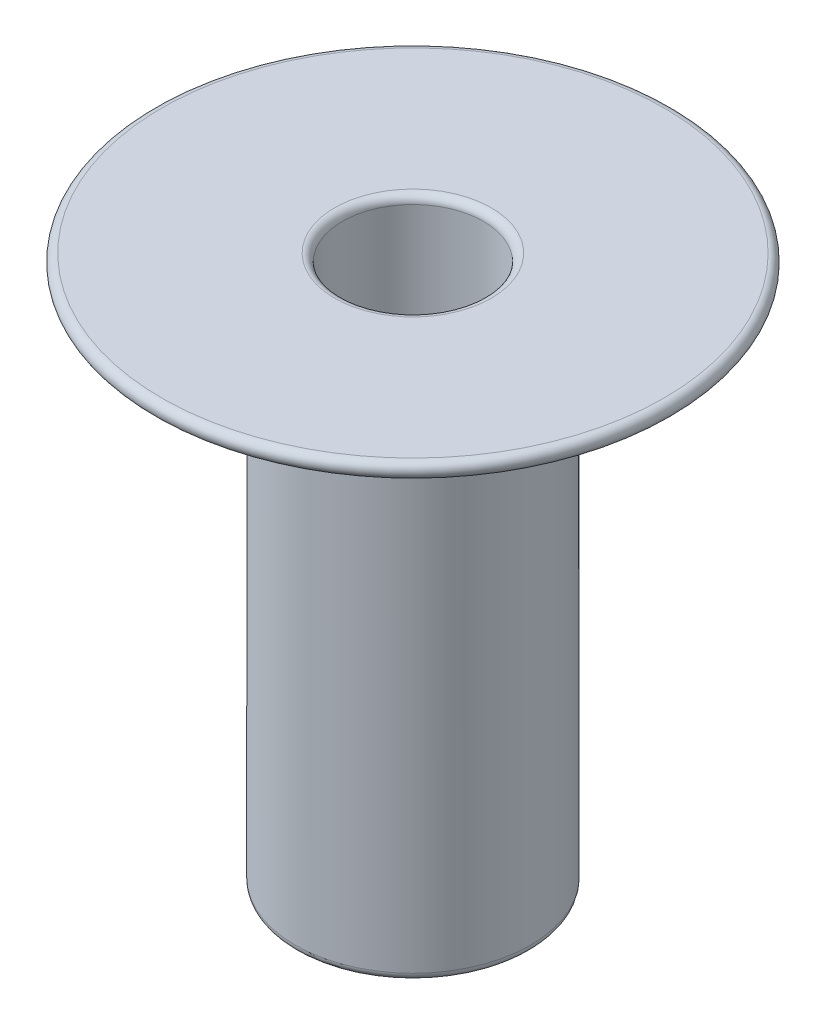
ISO-10303-21;
HEADER;
FILE_DESCRIPTION(('STEP AP214'),'2;1');
FILE_NAME('part.step','',(''),(''),'','','');
FILE_SCHEMA(('AUTOMOTIVE_DESIGN { 1 0 10303 214 1 1 1 1 }'));
ENDSEC;
DATA;
#1=APPLICATION_CONTEXT('core data for automotive mechanical design processes');
#2=APPLICATION_PROTOCOL_DEFINITION('international standard','automotive_design',2000,#1);
#3=PRODUCT_CONTEXT('',#1,'mechanical');
#4=PRODUCT('Part','Part','',(#3));
#5=PRODUCT_RELATED_PRODUCT_CATEGORY('part','',(#4));
#6=PRODUCT_DEFINITION_FORMATION('','',#4);
#7=PRODUCT_DEFINITION_CONTEXT('part definition',#1,'design');
#8=PRODUCT_DEFINITION('design','',#6,#7);
#9=PRODUCT_DEFINITION_SHAPE('','',#8);
#10=(LENGTH_UNIT() NAMED_UNIT(*) SI_UNIT(.MILLI.,.METRE.));
#11=(NAMED_UNIT(*) PLANE_ANGLE_UNIT() SI_UNIT($,.RADIAN.));
#12=(NAMED_UNIT(*) SI_UNIT($,.STERADIAN.) SOLID_ANGLE_UNIT());
#13=UNCERTAINTY_MEASURE_WITH_UNIT(LENGTH_MEASURE(1.E-05),#10,'distance_accuracy_value','');
#14=(GEOMETRIC_REPRESENTATION_CONTEXT(3) GLOBAL_UNCERTAINTY_ASSIGNED_CONTEXT((#13)) GLOBAL_UNIT_ASSIGNED_CONTEXT((#10,
#11,#12)) REPRESENTATION_CONTEXT('',''));
#15=CARTESIAN_POINT('',(0.,0.,0.));
#16=DIRECTION('',(0.,0.,1.));
#17=DIRECTION('',(1.,0.,0.));
#18=AXIS2_PLACEMENT_3D('',#15,#16,#17);
#19=CARTESIAN_POINT('',(0.,-4.6,0.));
#20=DIRECTION('',(-7.45706304105601E-13,-1.,0.));
#21=DIRECTION('',(1.,-7.45706304105601E-13,0.));
#22=AXIS2_PLACEMENT_3D('',#19,#20,#21);
#23=CYLINDRICAL_SURFACE('',#22,0.900000000004325);
#24=CARTESIAN_POINT('',(3.50481962929609E-12,0.0999999999996854,0.));
#25=DIRECTION('',(-7.45706304105601E-13,-1.,0.));
#26=DIRECTION('',(1.,-7.45706304105601E-13,0.));
#27=AXIS2_PLACEMENT_3D('',#24,#25,#26);
#28=CIRCLE('',#27,0.900000000004325);
#29=CARTESIAN_POINT('',(0.90000000000783,0.0999999999990143,0.));
#30=VERTEX_POINT('',#29);
#31=EDGE_CURVE('E54',#30,#30,#28,.T.);
#32=ORIENTED_EDGE('',*,*,#31,.T.);
#33=EDGE_LOOP('',(#32));
#34=FACE_BOUND('',#33,.T.);
#35=CARTESIAN_POINT('',(5.14537349832739E-12,2.29999999999831,0.));
#36=DIRECTION('',(-7.45706304105601E-13,-1.,0.));
#37=DIRECTION('',(1.,-7.45706304105601E-13,0.));
#38=AXIS2_PLACEMENT_3D('',#35,#36,#37);
#39=CIRCLE('',#38,0.900000000004325);
#40=CARTESIAN_POINT('',(0.90000000000947,2.29999999999764,0.));
#41=VERTEX_POINT('',#40);
#42=EDGE_CURVE('E57',#41,#41,#39,.F.);
#43=ORIENTED_EDGE('',*,*,#42,.T.);
#44=EDGE_LOOP('',(#43));
#45=FACE_BOUND('',#44,.T.);
#46=ADVANCED_FACE('F34',(#34,#45),#23,.F.);
#47=CARTESIAN_POINT('',(-0.9,2.39999999999898,0.));
#48=DIRECTION('',(-7.45706304105601E-13,-1.,0.));
#49=DIRECTION('',(1.,-7.45706304105601E-13,0.));
#50=AXIS2_PLACEMENT_3D('',#47,#48,#49);
#51=PLANE('',#50);
#52=CARTESIAN_POINT('',(5.21994412873795E-12,2.39999999999831,0.));
#53=DIRECTION('',(-7.45706304105601E-13,-1.,0.));
#54=DIRECTION('',(1.,-7.45706304105601E-13,0.));
#55=AXIS2_PLACEMENT_3D('',#52,#53,#54);
#56=CIRCLE('',#55,1.00000000000433);
#57=CARTESIAN_POINT('',(1.00000000000955,2.39999999999756,0.));
#58=VERTEX_POINT('',#57);
#59=EDGE_CURVE('E41',#58,#58,#56,.T.);
#60=ORIENTED_EDGE('',*,*,#59,.T.);
#61=EDGE_LOOP('',(#60));
#62=FACE_BOUND('',#61,.T.);
#63=CARTESIAN_POINT('',(5.21994412873795E-12,2.39999999999831,0.));
#64=DIRECTION('',(-7.45706304105601E-13,-1.,0.));
#65=DIRECTION('',(1.,-7.45706304105601E-13,0.));
#66=AXIS2_PLACEMENT_3D('',#63,#64,#65);
#67=CIRCLE('',#66,3.20525588833213);
#68=CARTESIAN_POINT('',(3.20525588833735,2.39999999999592,0.));
#69=VERTEX_POINT('',#68);
#70=EDGE_CURVE('E45',#69,#69,#67,.F.);
#71=ORIENTED_EDGE('',*,*,#70,.T.);
#72=EDGE_LOOP('',(#71));
#73=FACE_BOUND('',#72,.T.);
#74=ADVANCED_FACE('F74',(#62,#73),#51,.F.);
#75=CARTESIAN_POINT('',(5.21994412873722E-12,2.39999999999733,0.));
#76=DIRECTION('',(7.45706304105601E-13,1.,0.));
#77=DIRECTION('',(-1.,7.45706304105601E-13,0.));
#78=AXIS2_PLACEMENT_3D('',#75,#76,#77);
#79=CONICAL_SURFACE('',#78,3.57846096908789,1.04719755119735);
#80=CARTESIAN_POINT('',(5.08079343801559E-12,2.21339745961983,0.));
#81=DIRECTION('',(-7.45706304105601E-13,-1.,0.));
#82=DIRECTION('',(1.,-7.45706304105601E-13,0.));
#83=AXIS2_PLACEMENT_3D('',#80,#81,#82);
#84=CIRCLE('',#83,3.25525588833207);
#85=CARTESIAN_POINT('',(3.25525588833715,2.2133974596174,0.));
#86=VERTEX_POINT('',#85);
#87=EDGE_CURVE('E10',#86,#86,#84,.T.);
#88=ORIENTED_EDGE('',*,*,#87,.T.);
#89=EDGE_LOOP('',(#88));
#90=FACE_BOUND('',#89,.T.);
#91=CARTESIAN_POINT('',(4.32509656381165E-12,1.19999999999888,0.));
#92=DIRECTION('',(-7.45706304105601E-13,-1.,0.));
#93=DIRECTION('',(1.,-7.45706304105601E-13,0.));
#94=AXIS2_PLACEMENT_3D('',#91,#92,#93);
#95=CIRCLE('',#94,1.50000000000433);
#96=CARTESIAN_POINT('',(1.50000000000865,1.19999999999776,0.));
#97=VERTEX_POINT('',#96);
#98=EDGE_CURVE('E66',#97,#97,#95,.T.);
#99=ORIENTED_EDGE('',*,*,#98,.F.);
#100=EDGE_LOOP('',(#99));
#101=FACE_BOUND('',#100,.T.);
#102=ADVANCED_FACE('F72',(#90,#101),#79,.T.);
#103=CARTESIAN_POINT('',(0.,-4.6,0.));
#104=DIRECTION('',(-7.45706304105601E-13,-1.,0.));
#105=DIRECTION('',(1.,-7.45706304105601E-13,0.));
#106=AXIS2_PLACEMENT_3D('',#103,#104,#105);
#107=CYLINDRICAL_SURFACE('',#106,1.50000000000216);
#108=CARTESIAN_POINT('',(0.,-4.50000000000058,0.));
#109=DIRECTION('',(7.45706304105601E-13,1.,0.));
#110=DIRECTION('',(-1.,7.45706304105601E-13,0.));
#111=AXIS2_PLACEMENT_3D('',#108,#109,#110);
#112=CIRCLE('',#111,1.50000000000216);
#113=CARTESIAN_POINT('',(-1.50000000000209,-4.49999999999946,0.));
#114=VERTEX_POINT('',#113);
#115=EDGE_CURVE('E60',#114,#114,#112,.T.);
#116=ORIENTED_EDGE('',*,*,#115,.T.);
#117=EDGE_LOOP('',(#116));
#118=FACE_BOUND('',#117,.T.);
#119=ORIENTED_EDGE('',*,*,#98,.T.);
#120=EDGE_LOOP('',(#119));
#121=FACE_BOUND('',#120,.T.);
#122=ADVANCED_FACE('F70',(#118,#121),#107,.T.);
#123=CARTESIAN_POINT('',(-1.5,-4.59999999999946,0.));
#124=DIRECTION('',(7.45706304105601E-13,1.,0.));
#125=DIRECTION('',(-1.,7.45706304105601E-13,0.));
#126=AXIS2_PLACEMENT_3D('',#123,#124,#125);
#127=PLANE('',#126);
#128=CARTESIAN_POINT('',(0.,-4.60000000000058,0.));
#129=DIRECTION('',(7.45706304105601E-13,1.,0.));
#130=DIRECTION('',(-1.,7.45706304105601E-13,0.));
#131=AXIS2_PLACEMENT_3D('',#128,#129,#130);
#132=CIRCLE('',#131,1.40000000000216);
#133=CARTESIAN_POINT('',(-1.40000000000216,-4.59999999999954,0.));
#134=VERTEX_POINT('',#133);
#135=EDGE_CURVE('E63',#134,#134,#132,.F.);
#136=ORIENTED_EDGE('',*,*,#135,.T.);
#137=EDGE_LOOP('',(#136));
#138=FACE_BOUND('',#137,.T.);
#139=ADVANCED_FACE('F80',(#138),#127,.F.);
#140=CARTESIAN_POINT('',(-0.9,3.56601358995018E-13,0.));
#141=DIRECTION('',(-7.45706304105601E-13,-1.,0.));
#142=DIRECTION('',(1.,-7.45706304105601E-13,0.));
#143=AXIS2_PLACEMENT_3D('',#140,#141,#142);
#144=PLANE('',#143);
#145=CARTESIAN_POINT('',(3.43024899888553E-12,-3.14527050238045E-13,0.));
#146=DIRECTION('',(-7.45706304105601E-13,-1.,0.));
#147=DIRECTION('',(1.,-7.45706304105601E-13,0.));
#148=AXIS2_PLACEMENT_3D('',#145,#146,#147);
#149=CIRCLE('',#148,0.800000000004325);
#150=CARTESIAN_POINT('',(0.800000000007755,-9.11092093525751E-13,0.));
#151=VERTEX_POINT('',#150);
#152=EDGE_CURVE('E49',#151,#151,#149,.F.);
#153=ORIENTED_EDGE('',*,*,#152,.T.);
#154=EDGE_LOOP('',(#153));
#155=FACE_BOUND('',#154,.T.);
#156=ADVANCED_FACE('F95',(#155),#144,.F.);
#157=CARTESIAN_POINT('',(0.,-4.50000000000058,0.));
#158=DIRECTION('',(7.45706304105601E-13,1.,0.));
#159=DIRECTION('',(-1.,7.45706304105601E-13,0.));
#160=AXIS2_PLACEMENT_3D('',#157,#158,#159);
#161=TOROIDAL_SURFACE('',#160,1.40000000000216,0.1);
#162=ORIENTED_EDGE('',*,*,#115,.F.);
#163=EDGE_LOOP('',(#162));
#164=FACE_BOUND('',#163,.T.);
#165=ORIENTED_EDGE('',*,*,#135,.F.);
#166=EDGE_LOOP('',(#165));
#167=FACE_BOUND('',#166,.T.);
#168=ADVANCED_FACE('F91',(#164,#167),#161,.T.);
#169=CARTESIAN_POINT('',(3.50481962929609E-12,0.0999999999996854,0.));
#170=DIRECTION('',(-7.45706304105601E-13,-1.,0.));
#171=DIRECTION('',(1.,-7.45706304105601E-13,0.));
#172=AXIS2_PLACEMENT_3D('',#169,#170,#171);
#173=TOROIDAL_SURFACE('',#172,0.800000000004325,0.1);
#174=ORIENTED_EDGE('',*,*,#152,.F.);
#175=EDGE_LOOP('',(#174));
#176=FACE_BOUND('',#175,.T.);
#177=ORIENTED_EDGE('',*,*,#31,.F.);
#178=EDGE_LOOP('',(#177));
#179=FACE_BOUND('',#178,.T.);
#180=ADVANCED_FACE('F94',(#176,#179),#173,.F.);
#181=CARTESIAN_POINT('',(5.14537349832739E-12,2.29999999999831,0.));
#182=DIRECTION('',(-7.45706304105601E-13,-1.,0.));
#183=DIRECTION('',(1.,-7.45706304105601E-13,0.));
#184=AXIS2_PLACEMENT_3D('',#181,#182,#183);
#185=TOROIDAL_SURFACE('',#184,1.00000000000433,0.1);
#186=ORIENTED_EDGE('',*,*,#42,.F.);
#187=EDGE_LOOP('',(#186));
#188=FACE_BOUND('',#187,.T.);
#189=ORIENTED_EDGE('',*,*,#59,.F.);
#190=EDGE_LOOP('',(#189));
#191=FACE_BOUND('',#190,.T.);
#192=ADVANCED_FACE('F98',(#188,#191),#185,.T.);
#193=CARTESIAN_POINT('',(5.14537349832739E-12,2.29999999999831,0.));
#194=DIRECTION('',(-7.45706304105601E-13,-1.,0.));
#195=DIRECTION('',(1.,-7.45706304105601E-13,0.));
#196=AXIS2_PLACEMENT_3D('',#193,#194,#195);
#197=TOROIDAL_SURFACE('',#196,3.20525588833213,0.1);
#198=ORIENTED_EDGE('',*,*,#70,.F.);
#199=EDGE_LOOP('',(#198));
#200=FACE_BOUND('',#199,.T.);
#201=ORIENTED_EDGE('',*,*,#87,.F.);
#202=EDGE_LOOP('',(#201));
#203=FACE_BOUND('',#202,.T.);
#204=ADVANCED_FACE('F36',(#200,#203),#197,.T.);
#205=CLOSED_SHELL('',(#46,#74,#102,#122,#139,#156,#168,#180,#192,#204));
#206=MANIFOLD_SOLID_BREP('B2',#205);
#207=ADVANCED_BREP_SHAPE_REPRESENTATION('',(#18,#206),#14);
#208=SHAPE_DEFINITION_REPRESENTATION(#9,#207);
ENDSEC;
END-ISO-10303-21;
